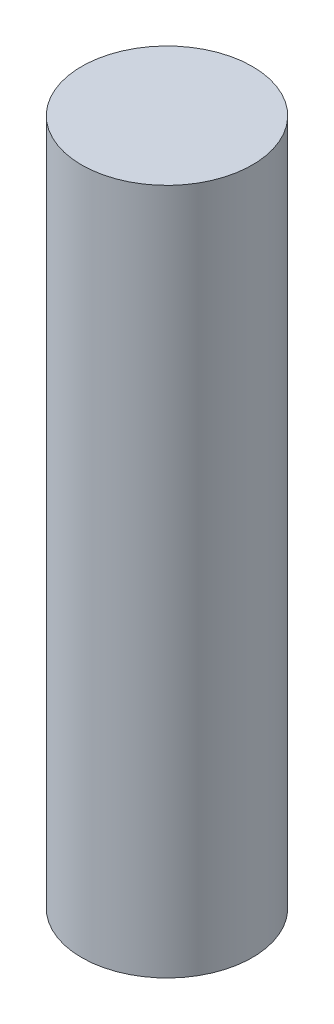
ISO-10303-21;
HEADER;
FILE_DESCRIPTION(('STEP AP214'),'2;1');
FILE_NAME('part.step','',(''),(''),'','','');
FILE_SCHEMA(('AUTOMOTIVE_DESIGN { 1 0 10303 214 1 1 1 1 }'));
ENDSEC;
DATA;
#1=APPLICATION_CONTEXT('core data for automotive mechanical design processes');
#2=APPLICATION_PROTOCOL_DEFINITION('international standard','automotive_design',2000,#1);
#3=PRODUCT_CONTEXT('',#1,'mechanical');
#4=PRODUCT('Part','Part','',(#3));
#5=PRODUCT_RELATED_PRODUCT_CATEGORY('part','',(#4));
#6=PRODUCT_DEFINITION_FORMATION('','',#4);
#7=PRODUCT_DEFINITION_CONTEXT('part definition',#1,'design');
#8=PRODUCT_DEFINITION('design','',#6,#7);
#9=PRODUCT_DEFINITION_SHAPE('','',#8);
#10=(LENGTH_UNIT() NAMED_UNIT(*) SI_UNIT(.MILLI.,.METRE.));
#11=(NAMED_UNIT(*) PLANE_ANGLE_UNIT() SI_UNIT($,.RADIAN.));
#12=(NAMED_UNIT(*) SI_UNIT($,.STERADIAN.) SOLID_ANGLE_UNIT());
#13=UNCERTAINTY_MEASURE_WITH_UNIT(LENGTH_MEASURE(1.E-05),#10,'distance_accuracy_value','');
#14=(GEOMETRIC_REPRESENTATION_CONTEXT(3) GLOBAL_UNCERTAINTY_ASSIGNED_CONTEXT((#13)) GLOBAL_UNIT_ASSIGNED_CONTEXT((#10,
#11,#12)) REPRESENTATION_CONTEXT('',''));
#15=CARTESIAN_POINT('',(0.,0.,0.));
#16=DIRECTION('',(0.,0.,1.));
#17=DIRECTION('',(1.,0.,0.));
#18=AXIS2_PLACEMENT_3D('',#15,#16,#17);
#19=CARTESIAN_POINT('',(0.,51.054,0.));
#20=DIRECTION('',(0.,1.,0.));
#21=DIRECTION('',(0.,0.,1.));
#22=AXIS2_PLACEMENT_3D('',#19,#20,#21);
#23=PLANE('',#22);
#24=CARTESIAN_POINT('',(0.,51.054,0.));
#25=DIRECTION('',(0.,-1.,0.));
#26=DIRECTION('',(0.,0.,-1.));
#27=AXIS2_PLACEMENT_3D('',#24,#25,#26);
#28=CIRCLE('',#27,6.35);
#29=CARTESIAN_POINT('',(0.,51.054,-6.35));
#30=VERTEX_POINT('',#29);
#31=EDGE_CURVE('E18',#30,#30,#28,.T.);
#32=ORIENTED_EDGE('',*,*,#31,.F.);
#33=EDGE_LOOP('',(#32));
#34=FACE_BOUND('',#33,.T.);
#35=ADVANCED_FACE('F15',(#34),#23,.T.);
#36=CARTESIAN_POINT('',(0.,0.,0.));
#37=DIRECTION('',(0.,1.,0.));
#38=DIRECTION('',(0.,0.,1.));
#39=AXIS2_PLACEMENT_3D('',#36,#37,#38);
#40=PLANE('',#39);
#41=CARTESIAN_POINT('',(0.,0.,0.));
#42=DIRECTION('',(0.,-1.,0.));
#43=DIRECTION('',(0.,0.,-1.));
#44=AXIS2_PLACEMENT_3D('',#41,#42,#43);
#45=CIRCLE('',#44,6.35);
#46=CARTESIAN_POINT('',(0.,0.,-6.35));
#47=VERTEX_POINT('',#46);
#48=EDGE_CURVE('E10',#47,#47,#45,.F.);
#49=ORIENTED_EDGE('',*,*,#48,.F.);
#50=EDGE_LOOP('',(#49));
#51=FACE_BOUND('',#50,.T.);
#52=ADVANCED_FACE('F30',(#51),#40,.F.);
#53=CARTESIAN_POINT('',(0.,51.054,0.));
#54=DIRECTION('',(0.,-1.,0.));
#55=DIRECTION('',(0.,0.,-1.));
#56=AXIS2_PLACEMENT_3D('',#53,#54,#55);
#57=CYLINDRICAL_SURFACE('',#56,6.35);
#58=ORIENTED_EDGE('',*,*,#48,.T.);
#59=EDGE_LOOP('',(#58));
#60=FACE_BOUND('',#59,.T.);
#61=ORIENTED_EDGE('',*,*,#31,.T.);
#62=EDGE_LOOP('',(#61));
#63=FACE_BOUND('',#62,.T.);
#64=ADVANCED_FACE('F27',(#60,#63),#57,.T.);
#65=CLOSED_SHELL('',(#35,#52,#64));
#66=MANIFOLD_SOLID_BREP('B1',#65);
#67=ADVANCED_BREP_SHAPE_REPRESENTATION('',(#18,#66),#14);
#68=SHAPE_DEFINITION_REPRESENTATION(#9,#67);
ENDSEC;
END-ISO-10303-21;
